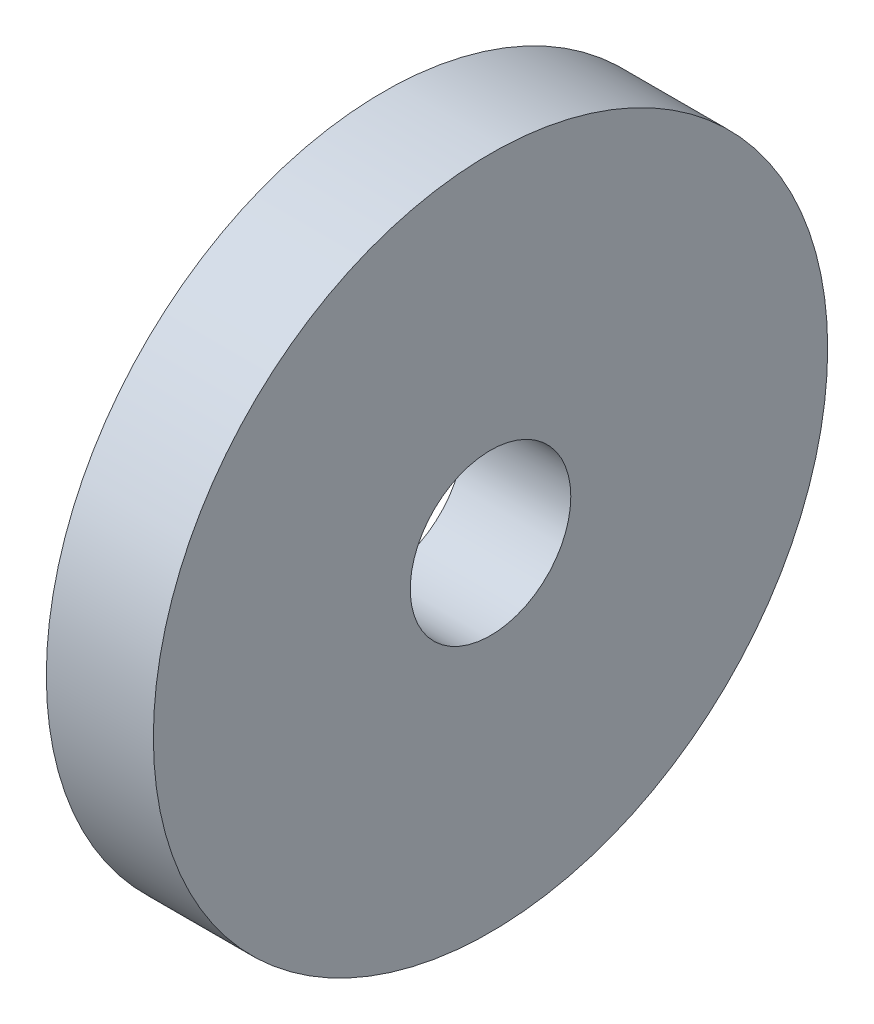
ISO-10303-21;
HEADER;
FILE_DESCRIPTION(('STEP AP214'),'2;1');
FILE_NAME('part.step','',(''),(''),'','','');
FILE_SCHEMA(('AUTOMOTIVE_DESIGN { 1 0 10303 214 1 1 1 1 }'));
ENDSEC;
DATA;
#1=APPLICATION_CONTEXT('core data for automotive mechanical design processes');
#2=APPLICATION_PROTOCOL_DEFINITION('international standard','automotive_design',2000,#1);
#3=PRODUCT_CONTEXT('',#1,'mechanical');
#4=PRODUCT('Part','Part','',(#3));
#5=PRODUCT_RELATED_PRODUCT_CATEGORY('part','',(#4));
#6=PRODUCT_DEFINITION_FORMATION('','',#4);
#7=PRODUCT_DEFINITION_CONTEXT('part definition',#1,'design');
#8=PRODUCT_DEFINITION('design','',#6,#7);
#9=PRODUCT_DEFINITION_SHAPE('','',#8);
#10=(LENGTH_UNIT() NAMED_UNIT(*) SI_UNIT(.MILLI.,.METRE.));
#11=(NAMED_UNIT(*) PLANE_ANGLE_UNIT() SI_UNIT($,.RADIAN.));
#12=(NAMED_UNIT(*) SI_UNIT($,.STERADIAN.) SOLID_ANGLE_UNIT());
#13=UNCERTAINTY_MEASURE_WITH_UNIT(LENGTH_MEASURE(1.E-05),#10,'distance_accuracy_value','');
#14=(GEOMETRIC_REPRESENTATION_CONTEXT(3) GLOBAL_UNCERTAINTY_ASSIGNED_CONTEXT((#13)) GLOBAL_UNIT_ASSIGNED_CONTEXT((#10,
#11,#12)) REPRESENTATION_CONTEXT('',''));
#15=CARTESIAN_POINT('',(0.,0.,0.));
#16=DIRECTION('',(0.,0.,1.));
#17=DIRECTION('',(1.,0.,0.));
#18=AXIS2_PLACEMENT_3D('',#15,#16,#17);
#19=CARTESIAN_POINT('',(2.,0.,0.));
#20=DIRECTION('',(1.,0.,0.));
#21=DIRECTION('',(0.,0.,-1.));
#22=AXIS2_PLACEMENT_3D('',#19,#20,#21);
#23=PLANE('',#22);
#24=CARTESIAN_POINT('',(2.,0.,0.));
#25=DIRECTION('',(1.,0.,0.));
#26=DIRECTION('',(0.,0.,-1.));
#27=AXIS2_PLACEMENT_3D('',#24,#25,#26);
#28=CIRCLE('',#27,6.3);
#29=CARTESIAN_POINT('',(2.,0.,-6.3));
#30=VERTEX_POINT('',#29);
#31=EDGE_CURVE('E10',#30,#30,#28,.T.);
#32=ORIENTED_EDGE('',*,*,#31,.T.);
#33=EDGE_LOOP('',(#32));
#34=FACE_BOUND('',#33,.T.);
#35=CARTESIAN_POINT('',(2.,0.,0.));
#36=DIRECTION('',(1.,0.,0.));
#37=DIRECTION('',(0.,0.,-1.));
#38=AXIS2_PLACEMENT_3D('',#35,#36,#37);
#39=CIRCLE('',#38,1.5);
#40=CARTESIAN_POINT('',(2.,0.,-1.5));
#41=VERTEX_POINT('',#40);
#42=EDGE_CURVE('E50',#41,#41,#39,.T.);
#43=ORIENTED_EDGE('',*,*,#42,.F.);
#44=EDGE_LOOP('',(#43));
#45=FACE_BOUND('',#44,.T.);
#46=ADVANCED_FACE('F37',(#34,#45),#23,.T.);
#47=CARTESIAN_POINT('',(0.,0.,0.));
#48=DIRECTION('',(1.,0.,0.));
#49=DIRECTION('',(0.,0.,-1.));
#50=AXIS2_PLACEMENT_3D('',#47,#48,#49);
#51=PLANE('',#50);
#52=CARTESIAN_POINT('',(0.,0.,0.));
#53=DIRECTION('',(1.,0.,0.));
#54=DIRECTION('',(0.,0.,-1.));
#55=AXIS2_PLACEMENT_3D('',#52,#53,#54);
#56=CIRCLE('',#55,6.3);
#57=CARTESIAN_POINT('',(0.,0.,-6.3));
#58=VERTEX_POINT('',#57);
#59=EDGE_CURVE('E41',#58,#58,#56,.T.);
#60=ORIENTED_EDGE('',*,*,#59,.F.);
#61=EDGE_LOOP('',(#60));
#62=FACE_BOUND('',#61,.T.);
#63=CARTESIAN_POINT('',(0.,0.,0.));
#64=DIRECTION('',(1.,0.,0.));
#65=DIRECTION('',(0.,0.,-1.));
#66=AXIS2_PLACEMENT_3D('',#63,#64,#65);
#67=CIRCLE('',#66,1.5);
#68=CARTESIAN_POINT('',(0.,0.,-1.5));
#69=VERTEX_POINT('',#68);
#70=EDGE_CURVE('E52',#69,#69,#67,.T.);
#71=ORIENTED_EDGE('',*,*,#70,.T.);
#72=EDGE_LOOP('',(#71));
#73=FACE_BOUND('',#72,.T.);
#74=ADVANCED_FACE('F64',(#62,#73),#51,.F.);
#75=CARTESIAN_POINT('',(2.,0.,0.));
#76=DIRECTION('',(-1.,0.,0.));
#77=DIRECTION('',(0.,0.,1.));
#78=AXIS2_PLACEMENT_3D('',#75,#76,#77);
#79=CYLINDRICAL_SURFACE('',#78,6.3);
#80=ORIENTED_EDGE('',*,*,#31,.F.);
#81=EDGE_LOOP('',(#80));
#82=FACE_BOUND('',#81,.T.);
#83=ORIENTED_EDGE('',*,*,#59,.T.);
#84=EDGE_LOOP('',(#83));
#85=FACE_BOUND('',#84,.T.);
#86=ADVANCED_FACE('F39',(#82,#85),#79,.T.);
#87=CARTESIAN_POINT('',(2.,0.,0.));
#88=DIRECTION('',(-1.,0.,0.));
#89=DIRECTION('',(0.,0.,1.));
#90=AXIS2_PLACEMENT_3D('',#87,#88,#89);
#91=CYLINDRICAL_SURFACE('',#90,1.5);
#92=ORIENTED_EDGE('',*,*,#42,.T.);
#93=EDGE_LOOP('',(#92));
#94=FACE_BOUND('',#93,.T.);
#95=ORIENTED_EDGE('',*,*,#70,.F.);
#96=EDGE_LOOP('',(#95));
#97=FACE_BOUND('',#96,.T.);
#98=ADVANCED_FACE('F60',(#94,#97),#91,.F.);
#99=CLOSED_SHELL('',(#46,#74,#86,#98));
#100=MANIFOLD_SOLID_BREP('B2',#99);
#101=ADVANCED_BREP_SHAPE_REPRESENTATION('',(#18,#100),#14);
#102=SHAPE_DEFINITION_REPRESENTATION(#9,#101);
ENDSEC;
END-ISO-10303-21;
